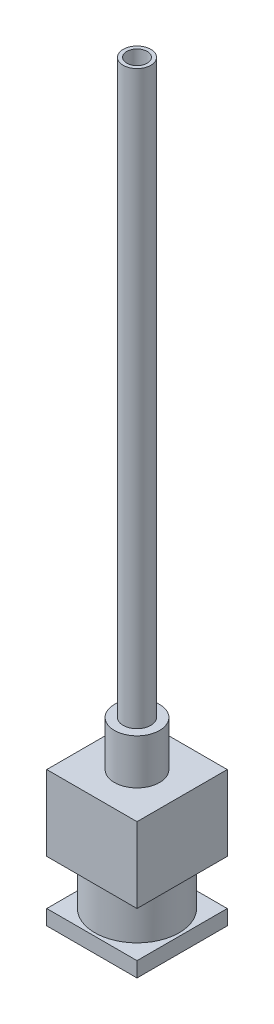
ISO-10303-21;
HEADER;
FILE_DESCRIPTION(('STEP AP214'),'2;1');
FILE_NAME('part.step','',(''),(''),'','','');
FILE_SCHEMA(('AUTOMOTIVE_DESIGN { 1 0 10303 214 1 1 1 1 }'));
ENDSEC;
DATA;
#1=APPLICATION_CONTEXT('core data for automotive mechanical design processes');
#2=APPLICATION_PROTOCOL_DEFINITION('international standard','automotive_design',2000,#1);
#3=PRODUCT_CONTEXT('',#1,'mechanical');
#4=PRODUCT('Part','Part','',(#3));
#5=PRODUCT_RELATED_PRODUCT_CATEGORY('part','',(#4));
#6=PRODUCT_DEFINITION_FORMATION('','',#4);
#7=PRODUCT_DEFINITION_CONTEXT('part definition',#1,'design');
#8=PRODUCT_DEFINITION('design','',#6,#7);
#9=PRODUCT_DEFINITION_SHAPE('','',#8);
#10=(LENGTH_UNIT() NAMED_UNIT(*) SI_UNIT(.MILLI.,.METRE.));
#11=(NAMED_UNIT(*) PLANE_ANGLE_UNIT() SI_UNIT($,.RADIAN.));
#12=(NAMED_UNIT(*) SI_UNIT($,.STERADIAN.) SOLID_ANGLE_UNIT());
#13=UNCERTAINTY_MEASURE_WITH_UNIT(LENGTH_MEASURE(1.E-05),#10,'distance_accuracy_value','');
#14=(GEOMETRIC_REPRESENTATION_CONTEXT(3) GLOBAL_UNCERTAINTY_ASSIGNED_CONTEXT((#13)) GLOBAL_UNIT_ASSIGNED_CONTEXT((#10,
#11,#12)) REPRESENTATION_CONTEXT('',''));
#15=CARTESIAN_POINT('',(0.,0.,0.));
#16=DIRECTION('',(0.,0.,1.));
#17=DIRECTION('',(1.,0.,0.));
#18=AXIS2_PLACEMENT_3D('',#15,#16,#17);
#19=CARTESIAN_POINT('',(-3.,9.,3.));
#20=DIRECTION('',(1.,0.,0.));
#21=DIRECTION('',(0.,0.,-1.));
#22=AXIS2_PLACEMENT_3D('',#19,#20,#21);
#23=PLANE('',#22);
#24=DIRECTION('',(0.,-1.,0.));
#25=VECTOR('',#24,1.);
#26=CARTESIAN_POINT('',(-3.,9.,3.));
#27=LINE('',#26,#25);
#28=CARTESIAN_POINT('',(-3.,1.,3.));
#29=VERTEX_POINT('',#28);
#30=CARTESIAN_POINT('',(-3.,0.,3.));
#31=VERTEX_POINT('',#30);
#32=EDGE_CURVE('E129',#29,#31,#27,.T.);
#33=ORIENTED_EDGE('',*,*,#32,.F.);
#34=DIRECTION('',(0.,0.,-1.));
#35=VECTOR('',#34,1.);
#36=CARTESIAN_POINT('',(-3.,1.,3.));
#37=LINE('',#36,#35);
#38=CARTESIAN_POINT('',(-3.,1.,-3.));
#39=VERTEX_POINT('',#38);
#40=EDGE_CURVE('E105',#29,#39,#37,.T.);
#41=ORIENTED_EDGE('',*,*,#40,.T.);
#42=DIRECTION('',(0.,-1.,0.));
#43=VECTOR('',#42,1.);
#44=CARTESIAN_POINT('',(-3.,9.,-3.));
#45=LINE('',#44,#43);
#46=CARTESIAN_POINT('',(-3.,0.,-3.));
#47=VERTEX_POINT('',#46);
#48=EDGE_CURVE('E147',#39,#47,#45,.T.);
#49=ORIENTED_EDGE('',*,*,#48,.T.);
#50=DIRECTION('',(0.,0.,1.));
#51=VECTOR('',#50,1.);
#52=CARTESIAN_POINT('',(-3.,0.,3.));
#53=LINE('',#52,#51);
#54=EDGE_CURVE('E143',#47,#31,#53,.T.);
#55=ORIENTED_EDGE('',*,*,#54,.T.);
#56=EDGE_LOOP('',(#33,#41,#49,#55));
#57=FACE_BOUND('',#56,.T.);
#58=ADVANCED_FACE('F37',(#57),#23,.F.);
#59=CARTESIAN_POINT('',(3.,9.,3.));
#60=DIRECTION('',(0.,0.,-1.));
#61=DIRECTION('',(-1.,0.,0.));
#62=AXIS2_PLACEMENT_3D('',#59,#60,#61);
#63=PLANE('',#62);
#64=DIRECTION('',(0.,-1.,0.));
#65=VECTOR('',#64,1.);
#66=CARTESIAN_POINT('',(3.,9.,3.));
#67=LINE('',#66,#65);
#68=CARTESIAN_POINT('',(3.,1.,3.));
#69=VERTEX_POINT('',#68);
#70=CARTESIAN_POINT('',(3.,0.,3.));
#71=VERTEX_POINT('',#70);
#72=EDGE_CURVE('E115',#69,#71,#67,.T.);
#73=ORIENTED_EDGE('',*,*,#72,.F.);
#74=DIRECTION('',(-1.,0.,0.));
#75=VECTOR('',#74,1.);
#76=CARTESIAN_POINT('',(3.,1.,3.));
#77=LINE('',#76,#75);
#78=EDGE_CURVE('E102',#69,#29,#77,.T.);
#79=ORIENTED_EDGE('',*,*,#78,.T.);
#80=ORIENTED_EDGE('',*,*,#32,.T.);
#81=DIRECTION('',(1.,0.,0.));
#82=VECTOR('',#81,1.);
#83=CARTESIAN_POINT('',(3.,0.,3.));
#84=LINE('',#83,#82);
#85=EDGE_CURVE('E123',#31,#71,#84,.T.);
#86=ORIENTED_EDGE('',*,*,#85,.T.);
#87=EDGE_LOOP('',(#73,#79,#80,#86));
#88=FACE_BOUND('',#87,.T.);
#89=ADVANCED_FACE('F121',(#88),#63,.F.);
#90=CARTESIAN_POINT('',(3.,9.,3.));
#91=DIRECTION('',(-1.,0.,0.));
#92=DIRECTION('',(0.,0.,1.));
#93=AXIS2_PLACEMENT_3D('',#90,#91,#92);
#94=PLANE('',#93);
#95=DIRECTION('',(0.,-1.,0.));
#96=VECTOR('',#95,1.);
#97=CARTESIAN_POINT('',(3.,9.,-3.));
#98=LINE('',#97,#96);
#99=CARTESIAN_POINT('',(3.,0.999999999999999,-3.));
#100=VERTEX_POINT('',#99);
#101=CARTESIAN_POINT('',(3.,0.,-3.));
#102=VERTEX_POINT('',#101);
#103=EDGE_CURVE('E117',#100,#102,#98,.T.);
#104=ORIENTED_EDGE('',*,*,#103,.F.);
#105=DIRECTION('',(0.,0.,1.));
#106=VECTOR('',#105,1.);
#107=CARTESIAN_POINT('',(3.,1.,-3.));
#108=LINE('',#107,#106);
#109=EDGE_CURVE('E54',#100,#69,#108,.T.);
#110=ORIENTED_EDGE('',*,*,#109,.T.);
#111=ORIENTED_EDGE('',*,*,#72,.T.);
#112=DIRECTION('',(0.,0.,-1.));
#113=VECTOR('',#112,1.);
#114=CARTESIAN_POINT('',(3.,0.,3.));
#115=LINE('',#114,#113);
#116=EDGE_CURVE('E144',#71,#102,#115,.T.);
#117=ORIENTED_EDGE('',*,*,#116,.T.);
#118=EDGE_LOOP('',(#104,#110,#111,#117));
#119=FACE_BOUND('',#118,.T.);
#120=ADVANCED_FACE('F113',(#119),#94,.F.);
#121=CARTESIAN_POINT('',(3.,9.,-3.));
#122=DIRECTION('',(0.,0.,1.));
#123=DIRECTION('',(1.,0.,0.));
#124=AXIS2_PLACEMENT_3D('',#121,#122,#123);
#125=PLANE('',#124);
#126=ORIENTED_EDGE('',*,*,#48,.F.);
#127=DIRECTION('',(1.,0.,0.));
#128=VECTOR('',#127,1.);
#129=CARTESIAN_POINT('',(-3.,1.,-3.));
#130=LINE('',#129,#128);
#131=EDGE_CURVE('E119',#39,#100,#130,.T.);
#132=ORIENTED_EDGE('',*,*,#131,.T.);
#133=ORIENTED_EDGE('',*,*,#103,.T.);
#134=DIRECTION('',(-1.,0.,0.));
#135=VECTOR('',#134,1.);
#136=CARTESIAN_POINT('',(3.,0.,-3.));
#137=LINE('',#136,#135);
#138=EDGE_CURVE('E159',#102,#47,#137,.T.);
#139=ORIENTED_EDGE('',*,*,#138,.T.);
#140=EDGE_LOOP('',(#126,#132,#133,#139));
#141=FACE_BOUND('',#140,.T.);
#142=ADVANCED_FACE('F203',(#141),#125,.F.);
#143=CARTESIAN_POINT('',(0.,0.,0.));
#144=DIRECTION('',(0.,1.,0.));
#145=DIRECTION('',(0.,0.,1.));
#146=AXIS2_PLACEMENT_3D('',#143,#144,#145);
#147=CYLINDRICAL_SURFACE('',#146,0.68);
#148=CARTESIAN_POINT('',(0.,50.,0.));
#149=DIRECTION('',(0.,1.,0.));
#150=DIRECTION('',(0.,0.,1.));
#151=AXIS2_PLACEMENT_3D('',#148,#149,#150);
#152=CIRCLE('',#151,0.68);
#153=CARTESIAN_POINT('',(0.,50.,0.68));
#154=VERTEX_POINT('',#153);
#155=EDGE_CURVE('E179',#154,#154,#152,.T.);
#156=ORIENTED_EDGE('',*,*,#155,.T.);
#157=EDGE_LOOP('',(#156));
#158=FACE_BOUND('',#157,.T.);
#159=CARTESIAN_POINT('',(0.,7.99999999999999,0.));
#160=DIRECTION('',(0.,-1.,0.));
#161=DIRECTION('',(0.,0.,-1.));
#162=AXIS2_PLACEMENT_3D('',#159,#160,#161);
#163=CIRCLE('',#162,0.68);
#164=CARTESIAN_POINT('',(0.,7.99999999999999,-0.68));
#165=VERTEX_POINT('',#164);
#166=EDGE_CURVE('E41',#165,#165,#163,.F.);
#167=ORIENTED_EDGE('',*,*,#166,.F.);
#168=EDGE_LOOP('',(#167));
#169=FACE_BOUND('',#168,.T.);
#170=ADVANCED_FACE('F205',(#158,#169),#147,.F.);
#171=CARTESIAN_POINT('',(0.,12.,0.));
#172=DIRECTION('',(0.,1.,0.));
#173=DIRECTION('',(0.,0.,1.));
#174=AXIS2_PLACEMENT_3D('',#171,#172,#173);
#175=PLANE('',#174);
#176=CARTESIAN_POINT('',(0.,12.,0.));
#177=DIRECTION('',(0.,1.,0.));
#178=DIRECTION('',(0.,0.,1.));
#179=AXIS2_PLACEMENT_3D('',#176,#177,#178);
#180=CIRCLE('',#179,1.5);
#181=CARTESIAN_POINT('',(0.,12.,1.5));
#182=VERTEX_POINT('',#181);
#183=EDGE_CURVE('E149',#182,#182,#180,.T.);
#184=ORIENTED_EDGE('',*,*,#183,.T.);
#185=EDGE_LOOP('',(#184));
#186=FACE_BOUND('',#185,.T.);
#187=CARTESIAN_POINT('',(0.,12.,0.));
#188=DIRECTION('',(0.,1.,0.));
#189=DIRECTION('',(0.,0.,1.));
#190=AXIS2_PLACEMENT_3D('',#187,#188,#189);
#191=CIRCLE('',#190,0.92);
#192=CARTESIAN_POINT('',(0.,12.,0.92));
#193=VERTEX_POINT('',#192);
#194=EDGE_CURVE('E176',#193,#193,#191,.T.);
#195=ORIENTED_EDGE('',*,*,#194,.F.);
#196=EDGE_LOOP('',(#195));
#197=FACE_BOUND('',#196,.T.);
#198=ADVANCED_FACE('F212',(#186,#197),#175,.T.);
#199=CARTESIAN_POINT('',(-3.,9.,-3.));
#200=VERTEX_POINT('',#199);
#201=CARTESIAN_POINT('',(-3.,4.,-3.));
#202=VERTEX_POINT('',#201);
#203=EDGE_CURVE('E161',#200,#202,#45,.T.);
#204=ORIENTED_EDGE('',*,*,#203,.T.);
#205=DIRECTION('',(0.,0.,-1.));
#206=VECTOR('',#205,1.);
#207=CARTESIAN_POINT('',(-3.,4.,3.));
#208=LINE('',#207,#206);
#209=CARTESIAN_POINT('',(-3.,4.,3.));
#210=VERTEX_POINT('',#209);
#211=EDGE_CURVE('E62',#210,#202,#208,.T.);
#212=ORIENTED_EDGE('',*,*,#211,.F.);
#213=CARTESIAN_POINT('',(-3.,9.,3.));
#214=VERTEX_POINT('',#213);
#215=EDGE_CURVE('E46',#214,#210,#27,.T.);
#216=ORIENTED_EDGE('',*,*,#215,.F.);
#217=DIRECTION('',(0.,0.,1.));
#218=VECTOR('',#217,1.);
#219=CARTESIAN_POINT('',(-3.,9.,3.));
#220=LINE('',#219,#218);
#221=EDGE_CURVE('E160',#200,#214,#220,.T.);
#222=ORIENTED_EDGE('',*,*,#221,.F.);
#223=EDGE_LOOP('',(#204,#212,#216,#222));
#224=FACE_BOUND('',#223,.T.);
#225=ADVANCED_FACE('F39',(#224),#23,.F.);
#226=ORIENTED_EDGE('',*,*,#215,.T.);
#227=DIRECTION('',(-1.,0.,0.));
#228=VECTOR('',#227,1.);
#229=CARTESIAN_POINT('',(3.,4.,3.));
#230=LINE('',#229,#228);
#231=CARTESIAN_POINT('',(3.,4.,3.));
#232=VERTEX_POINT('',#231);
#233=EDGE_CURVE('E194',#232,#210,#230,.T.);
#234=ORIENTED_EDGE('',*,*,#233,.F.);
#235=CARTESIAN_POINT('',(3.,9.,3.));
#236=VERTEX_POINT('',#235);
#237=EDGE_CURVE('E125',#236,#232,#67,.T.);
#238=ORIENTED_EDGE('',*,*,#237,.F.);
#239=DIRECTION('',(1.,0.,0.));
#240=VECTOR('',#239,1.);
#241=CARTESIAN_POINT('',(3.,9.,3.));
#242=LINE('',#241,#240);
#243=EDGE_CURVE('E170',#214,#236,#242,.T.);
#244=ORIENTED_EDGE('',*,*,#243,.F.);
#245=EDGE_LOOP('',(#226,#234,#238,#244));
#246=FACE_BOUND('',#245,.T.);
#247=ADVANCED_FACE('F225',(#246),#63,.F.);
#248=ORIENTED_EDGE('',*,*,#237,.T.);
#249=DIRECTION('',(0.,0.,1.));
#250=VECTOR('',#249,1.);
#251=CARTESIAN_POINT('',(3.,4.,-3.));
#252=LINE('',#251,#250);
#253=CARTESIAN_POINT('',(3.,4.,-3.));
#254=VERTEX_POINT('',#253);
#255=EDGE_CURVE('E192',#254,#232,#252,.T.);
#256=ORIENTED_EDGE('',*,*,#255,.F.);
#257=CARTESIAN_POINT('',(3.,9.,-3.));
#258=VERTEX_POINT('',#257);
#259=EDGE_CURVE('E126',#258,#254,#98,.T.);
#260=ORIENTED_EDGE('',*,*,#259,.F.);
#261=DIRECTION('',(0.,0.,-1.));
#262=VECTOR('',#261,1.);
#263=CARTESIAN_POINT('',(3.,9.,3.));
#264=LINE('',#263,#262);
#265=EDGE_CURVE('E166',#236,#258,#264,.T.);
#266=ORIENTED_EDGE('',*,*,#265,.F.);
#267=EDGE_LOOP('',(#248,#256,#260,#266));
#268=FACE_BOUND('',#267,.T.);
#269=ADVANCED_FACE('F216',(#268),#94,.F.);
#270=ORIENTED_EDGE('',*,*,#259,.T.);
#271=DIRECTION('',(1.,0.,0.));
#272=VECTOR('',#271,1.);
#273=CARTESIAN_POINT('',(-3.,4.,-3.));
#274=LINE('',#273,#272);
#275=EDGE_CURVE('E190',#202,#254,#274,.T.);
#276=ORIENTED_EDGE('',*,*,#275,.F.);
#277=ORIENTED_EDGE('',*,*,#203,.F.);
#278=DIRECTION('',(-1.,0.,0.));
#279=VECTOR('',#278,1.);
#280=CARTESIAN_POINT('',(3.,9.,-3.));
#281=LINE('',#280,#279);
#282=EDGE_CURVE('E155',#258,#200,#281,.T.);
#283=ORIENTED_EDGE('',*,*,#282,.F.);
#284=EDGE_LOOP('',(#270,#276,#277,#283));
#285=FACE_BOUND('',#284,.T.);
#286=ADVANCED_FACE('F207',(#285),#125,.F.);
#287=CARTESIAN_POINT('',(0.,9.,0.));
#288=DIRECTION('',(0.,1.,0.));
#289=DIRECTION('',(0.,0.,1.));
#290=AXIS2_PLACEMENT_3D('',#287,#288,#289);
#291=PLANE('',#290);
#292=CARTESIAN_POINT('',(0.,9.,0.));
#293=DIRECTION('',(0.,1.,0.));
#294=DIRECTION('',(0.,0.,1.));
#295=AXIS2_PLACEMENT_3D('',#292,#293,#294);
#296=CIRCLE('',#295,1.5);
#297=CARTESIAN_POINT('',(0.,9.,1.5));
#298=VERTEX_POINT('',#297);
#299=EDGE_CURVE('E12',#298,#298,#296,.T.);
#300=ORIENTED_EDGE('',*,*,#299,.F.);
#301=EDGE_LOOP('',(#300));
#302=FACE_BOUND('',#301,.T.);
#303=ORIENTED_EDGE('',*,*,#221,.T.);
#304=ORIENTED_EDGE('',*,*,#243,.T.);
#305=ORIENTED_EDGE('',*,*,#265,.T.);
#306=ORIENTED_EDGE('',*,*,#282,.T.);
#307=EDGE_LOOP('',(#303,#304,#305,#306));
#308=FACE_BOUND('',#307,.T.);
#309=ADVANCED_FACE('F219',(#302,#308),#291,.T.);
#310=CARTESIAN_POINT('',(0.,0.,0.));
#311=DIRECTION('',(0.,1.,0.));
#312=DIRECTION('',(0.,0.,1.));
#313=AXIS2_PLACEMENT_3D('',#310,#311,#312);
#314=PLANE('',#313);
#315=CARTESIAN_POINT('',(0.,0.,0.));
#316=DIRECTION('',(0.,-1.,0.));
#317=DIRECTION('',(0.,0.,-1.));
#318=AXIS2_PLACEMENT_3D('',#315,#316,#317);
#319=CIRCLE('',#318,2.);
#320=CARTESIAN_POINT('',(0.,0.,-2.));
#321=VERTEX_POINT('',#320);
#322=EDGE_CURVE('E184',#321,#321,#319,.T.);
#323=ORIENTED_EDGE('',*,*,#322,.F.);
#324=EDGE_LOOP('',(#323));
#325=FACE_BOUND('',#324,.T.);
#326=ORIENTED_EDGE('',*,*,#54,.F.);
#327=ORIENTED_EDGE('',*,*,#138,.F.);
#328=ORIENTED_EDGE('',*,*,#116,.F.);
#329=ORIENTED_EDGE('',*,*,#85,.F.);
#330=EDGE_LOOP('',(#326,#327,#328,#329));
#331=FACE_BOUND('',#330,.T.);
#332=ADVANCED_FACE('F141',(#325,#331),#314,.F.);
#333=CARTESIAN_POINT('',(0.,12.,0.));
#334=DIRECTION('',(0.,-1.,0.));
#335=DIRECTION('',(0.,0.,-1.));
#336=AXIS2_PLACEMENT_3D('',#333,#334,#335);
#337=CYLINDRICAL_SURFACE('',#336,1.5);
#338=ORIENTED_EDGE('',*,*,#183,.F.);
#339=EDGE_LOOP('',(#338));
#340=FACE_BOUND('',#339,.T.);
#341=ORIENTED_EDGE('',*,*,#299,.T.);
#342=EDGE_LOOP('',(#341));
#343=FACE_BOUND('',#342,.T.);
#344=ADVANCED_FACE('F238',(#340,#343),#337,.T.);
#345=CARTESIAN_POINT('',(0.,50.,0.));
#346=DIRECTION('',(0.,1.,0.));
#347=DIRECTION('',(0.,0.,1.));
#348=AXIS2_PLACEMENT_3D('',#345,#346,#347);
#349=PLANE('',#348);
#350=CARTESIAN_POINT('',(0.,50.,0.));
#351=DIRECTION('',(0.,1.,0.));
#352=DIRECTION('',(0.,0.,1.));
#353=AXIS2_PLACEMENT_3D('',#350,#351,#352);
#354=CIRCLE('',#353,0.92);
#355=CARTESIAN_POINT('',(0.,50.,0.92));
#356=VERTEX_POINT('',#355);
#357=EDGE_CURVE('E152',#356,#356,#354,.T.);
#358=ORIENTED_EDGE('',*,*,#357,.T.);
#359=EDGE_LOOP('',(#358));
#360=FACE_BOUND('',#359,.T.);
#361=ORIENTED_EDGE('',*,*,#155,.F.);
#362=EDGE_LOOP('',(#361));
#363=FACE_BOUND('',#362,.T.);
#364=ADVANCED_FACE('F241',(#360,#363),#349,.T.);
#365=CARTESIAN_POINT('',(0.,50.,0.));
#366=DIRECTION('',(0.,-1.,0.));
#367=DIRECTION('',(0.,0.,-1.));
#368=AXIS2_PLACEMENT_3D('',#365,#366,#367);
#369=CYLINDRICAL_SURFACE('',#368,0.92);
#370=ORIENTED_EDGE('',*,*,#357,.F.);
#371=EDGE_LOOP('',(#370));
#372=FACE_BOUND('',#371,.T.);
#373=ORIENTED_EDGE('',*,*,#194,.T.);
#374=EDGE_LOOP('',(#373));
#375=FACE_BOUND('',#374,.T.);
#376=ADVANCED_FACE('F263',(#372,#375),#369,.T.);
#377=CARTESIAN_POINT('',(0.,7.99999999999999,0.));
#378=DIRECTION('',(0.,-1.,0.));
#379=DIRECTION('',(0.,0.,-1.));
#380=AXIS2_PLACEMENT_3D('',#377,#378,#379);
#381=PLANE('',#380);
#382=CARTESIAN_POINT('',(0.,7.99999999999999,0.));
#383=DIRECTION('',(0.,-1.,0.));
#384=DIRECTION('',(0.,0.,-1.));
#385=AXIS2_PLACEMENT_3D('',#382,#383,#384);
#386=CIRCLE('',#385,2.);
#387=CARTESIAN_POINT('',(0.,7.99999999999999,-2.));
#388=VERTEX_POINT('',#387);
#389=EDGE_CURVE('E187',#388,#388,#386,.T.);
#390=ORIENTED_EDGE('',*,*,#389,.T.);
#391=EDGE_LOOP('',(#390));
#392=FACE_BOUND('',#391,.T.);
#393=ORIENTED_EDGE('',*,*,#166,.T.);
#394=EDGE_LOOP('',(#393));
#395=FACE_BOUND('',#394,.T.);
#396=ADVANCED_FACE('F254',(#392,#395),#381,.T.);
#397=CARTESIAN_POINT('',(0.,7.99999999999999,0.));
#398=DIRECTION('',(0.,-1.,0.));
#399=DIRECTION('',(0.,0.,-1.));
#400=AXIS2_PLACEMENT_3D('',#397,#398,#399);
#401=CYLINDRICAL_SURFACE('',#400,2.);
#402=ORIENTED_EDGE('',*,*,#389,.F.);
#403=EDGE_LOOP('',(#402));
#404=FACE_BOUND('',#403,.T.);
#405=ORIENTED_EDGE('',*,*,#322,.T.);
#406=EDGE_LOOP('',(#405));
#407=FACE_BOUND('',#406,.T.);
#408=ADVANCED_FACE('F251',(#404,#407),#401,.F.);
#409=CARTESIAN_POINT('',(0.,16.4852813742386,0.));
#410=DIRECTION('',(0.,-1.,0.));
#411=DIRECTION('',(0.,0.,-1.));
#412=AXIS2_PLACEMENT_3D('',#409,#410,#411);
#413=CYLINDRICAL_SURFACE('',#412,2.8);
#414=CARTESIAN_POINT('',(0.,1.,0.));
#415=DIRECTION('',(0.,-1.,0.));
#416=DIRECTION('',(0.,0.,-1.));
#417=AXIS2_PLACEMENT_3D('',#414,#415,#416);
#418=CIRCLE('',#417,2.8);
#419=CARTESIAN_POINT('',(0.,1.,-2.8));
#420=VERTEX_POINT('',#419);
#421=EDGE_CURVE('E109',#420,#420,#418,.T.);
#422=ORIENTED_EDGE('',*,*,#421,.F.);
#423=EDGE_LOOP('',(#422));
#424=FACE_BOUND('',#423,.T.);
#425=CARTESIAN_POINT('',(0.,4.,0.));
#426=DIRECTION('',(0.,1.,0.));
#427=DIRECTION('',(0.,0.,1.));
#428=AXIS2_PLACEMENT_3D('',#425,#426,#427);
#429=CIRCLE('',#428,2.8);
#430=CARTESIAN_POINT('',(0.,4.,2.8));
#431=VERTEX_POINT('',#430);
#432=EDGE_CURVE('E118',#431,#431,#429,.F.);
#433=ORIENTED_EDGE('',*,*,#432,.T.);
#434=EDGE_LOOP('',(#433));
#435=FACE_BOUND('',#434,.T.);
#436=ADVANCED_FACE('F253',(#424,#435),#413,.T.);
#437=CARTESIAN_POINT('',(0.,1.,0.));
#438=DIRECTION('',(0.,-1.,0.));
#439=DIRECTION('',(0.,0.,-1.));
#440=AXIS2_PLACEMENT_3D('',#437,#438,#439);
#441=PLANE('',#440);
#442=ORIENTED_EDGE('',*,*,#421,.T.);
#443=EDGE_LOOP('',(#442));
#444=FACE_BOUND('',#443,.T.);
#445=ORIENTED_EDGE('',*,*,#78,.F.);
#446=ORIENTED_EDGE('',*,*,#109,.F.);
#447=ORIENTED_EDGE('',*,*,#131,.F.);
#448=ORIENTED_EDGE('',*,*,#40,.F.);
#449=EDGE_LOOP('',(#445,#446,#447,#448));
#450=FACE_BOUND('',#449,.T.);
#451=ADVANCED_FACE('F103',(#444,#450),#441,.F.);
#452=CARTESIAN_POINT('',(0.,4.,0.));
#453=DIRECTION('',(0.,1.,0.));
#454=DIRECTION('',(0.,0.,1.));
#455=AXIS2_PLACEMENT_3D('',#452,#453,#454);
#456=PLANE('',#455);
#457=ORIENTED_EDGE('',*,*,#233,.T.);
#458=ORIENTED_EDGE('',*,*,#211,.T.);
#459=ORIENTED_EDGE('',*,*,#275,.T.);
#460=ORIENTED_EDGE('',*,*,#255,.T.);
#461=EDGE_LOOP('',(#457,#458,#459,#460));
#462=FACE_BOUND('',#461,.T.);
#463=ORIENTED_EDGE('',*,*,#432,.F.);
#464=EDGE_LOOP('',(#463));
#465=FACE_BOUND('',#464,.T.);
#466=ADVANCED_FACE('F358',(#462,#465),#456,.F.);
#467=CLOSED_SHELL('',(#58,#89,#120,#142,#170,#198,#225,#247,#269,#286,#309,#332,#344,#364,#376,
#396,#408,#436,#451,#466));
#468=MANIFOLD_SOLID_BREP('B2',#467);
#469=ADVANCED_BREP_SHAPE_REPRESENTATION('',(#18,#468),#14);
#470=SHAPE_DEFINITION_REPRESENTATION(#9,#469);
ENDSEC;
END-ISO-10303-21;
